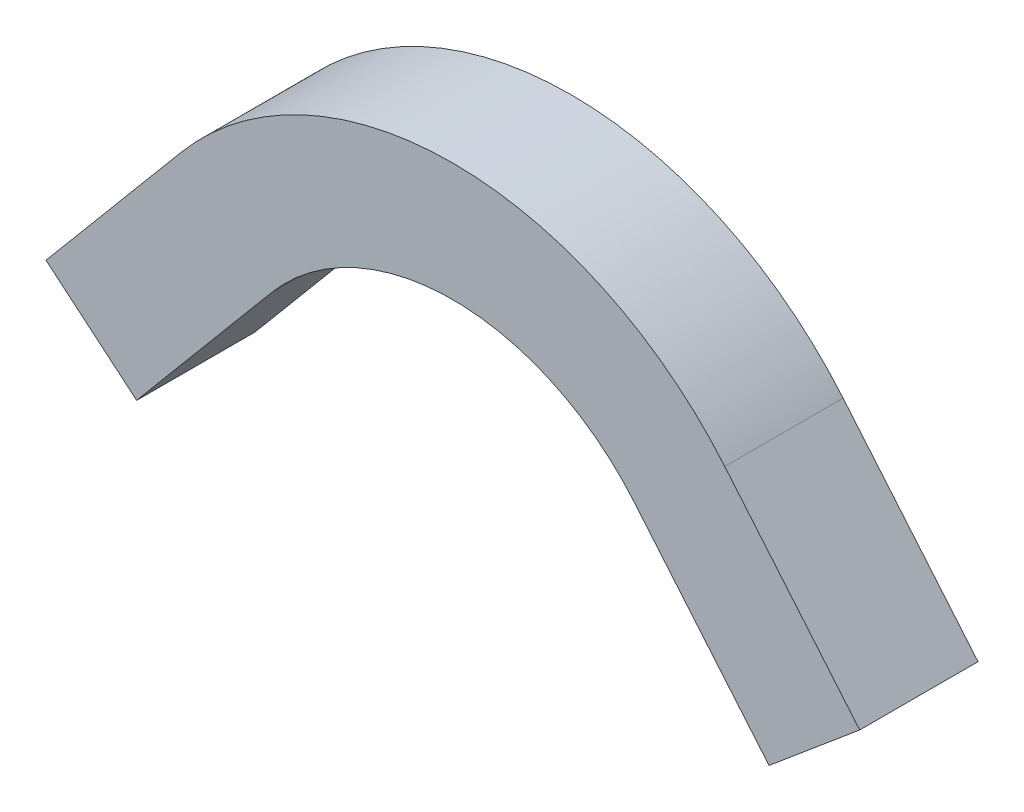
ISO-10303-21;
HEADER;
FILE_DESCRIPTION(('STEP AP214'),'2;1');
FILE_NAME('part.step','',(''),(''),'','','');
FILE_SCHEMA(('AUTOMOTIVE_DESIGN { 1 0 10303 214 1 1 1 1 }'));
ENDSEC;
DATA;
#1=APPLICATION_CONTEXT('core data for automotive mechanical design processes');
#2=APPLICATION_PROTOCOL_DEFINITION('international standard','automotive_design',2000,#1);
#3=PRODUCT_CONTEXT('',#1,'mechanical');
#4=PRODUCT('Part','Part','',(#3));
#5=PRODUCT_RELATED_PRODUCT_CATEGORY('part','',(#4));
#6=PRODUCT_DEFINITION_FORMATION('','',#4);
#7=PRODUCT_DEFINITION_CONTEXT('part definition',#1,'design');
#8=PRODUCT_DEFINITION('design','',#6,#7);
#9=PRODUCT_DEFINITION_SHAPE('','',#8);
#10=(LENGTH_UNIT() NAMED_UNIT(*) SI_UNIT(.MILLI.,.METRE.));
#11=(NAMED_UNIT(*) PLANE_ANGLE_UNIT() SI_UNIT($,.RADIAN.));
#12=(NAMED_UNIT(*) SI_UNIT($,.STERADIAN.) SOLID_ANGLE_UNIT());
#13=UNCERTAINTY_MEASURE_WITH_UNIT(LENGTH_MEASURE(1.E-05),#10,'distance_accuracy_value','');
#14=(GEOMETRIC_REPRESENTATION_CONTEXT(3) GLOBAL_UNCERTAINTY_ASSIGNED_CONTEXT((#13)) GLOBAL_UNIT_ASSIGNED_CONTEXT((#10,
#11,#12)) REPRESENTATION_CONTEXT('',''));
#15=CARTESIAN_POINT('',(0.,0.,0.));
#16=DIRECTION('',(0.,0.,1.));
#17=DIRECTION('',(1.,0.,0.));
#18=AXIS2_PLACEMENT_3D('',#15,#16,#17);
#19=CARTESIAN_POINT('',(0.,0.,10.));
#20=DIRECTION('',(0.,0.,-1.));
#21=DIRECTION('',(-1.,0.,0.));
#22=AXIS2_PLACEMENT_3D('',#19,#20,#21);
#23=CYLINDRICAL_SURFACE('',#22,60.);
#24=CARTESIAN_POINT('',(0.,0.,-10.));
#25=DIRECTION('',(0.,0.,1.));
#26=DIRECTION('',(1.,0.,0.));
#27=AXIS2_PLACEMENT_3D('',#24,#25,#26);
#28=CIRCLE('',#27,60.);
#29=CARTESIAN_POINT('',(45.9626665871387,38.5672565811923,-10.));
#30=VERTEX_POINT('',#29);
#31=CARTESIAN_POINT('',(-45.9626665871387,38.5672565811923,-10.));
#32=VERTEX_POINT('',#31);
#33=EDGE_CURVE('E59',#30,#32,#28,.T.);
#34=ORIENTED_EDGE('',*,*,#33,.T.);
#35=DIRECTION('',(0.,0.,-1.));
#36=VECTOR('',#35,1.);
#37=CARTESIAN_POINT('',(-45.9626665871387,38.5672565811923,10.));
#38=LINE('',#37,#36);
#39=CARTESIAN_POINT('',(-45.9626665871387,38.5672565811923,10.));
#40=VERTEX_POINT('',#39);
#41=EDGE_CURVE('E11',#40,#32,#38,.T.);
#42=ORIENTED_EDGE('',*,*,#41,.F.);
#43=CARTESIAN_POINT('',(0.,0.,10.));
#44=DIRECTION('',(0.,0.,1.));
#45=DIRECTION('',(1.,0.,0.));
#46=AXIS2_PLACEMENT_3D('',#43,#44,#45);
#47=CIRCLE('',#46,60.);
#48=CARTESIAN_POINT('',(45.9626665871387,38.5672565811923,10.));
#49=VERTEX_POINT('',#48);
#50=EDGE_CURVE('E49',#49,#40,#47,.T.);
#51=ORIENTED_EDGE('',*,*,#50,.F.);
#52=DIRECTION('',(0.,0.,-1.));
#53=VECTOR('',#52,1.);
#54=CARTESIAN_POINT('',(45.9626665871387,38.5672565811923,10.));
#55=LINE('',#54,#53);
#56=EDGE_CURVE('E87',#49,#30,#55,.T.);
#57=ORIENTED_EDGE('',*,*,#56,.T.);
#58=EDGE_LOOP('',(#34,#42,#51,#57));
#59=FACE_BOUND('',#58,.T.);
#60=ADVANCED_FACE('F33',(#59),#23,.T.);
#61=CARTESIAN_POINT('',(0.,0.,10.));
#62=DIRECTION('',(0.,0.,-1.));
#63=DIRECTION('',(-1.,0.,0.));
#64=AXIS2_PLACEMENT_3D('',#61,#62,#63);
#65=CYLINDRICAL_SURFACE('',#64,40.);
#66=CARTESIAN_POINT('',(0.,0.,-10.));
#67=DIRECTION('',(0.,0.,-1.));
#68=DIRECTION('',(1.,0.,0.));
#69=AXIS2_PLACEMENT_3D('',#66,#67,#68);
#70=CIRCLE('',#69,40.);
#71=CARTESIAN_POINT('',(-30.6417777247592,25.7115043874615,-10.));
#72=VERTEX_POINT('',#71);
#73=CARTESIAN_POINT('',(30.6417777247592,25.7115043874615,-10.));
#74=VERTEX_POINT('',#73);
#75=EDGE_CURVE('E68',#72,#74,#70,.T.);
#76=ORIENTED_EDGE('',*,*,#75,.T.);
#77=DIRECTION('',(0.,0.,-1.));
#78=VECTOR('',#77,1.);
#79=CARTESIAN_POINT('',(30.6417777247592,25.7115043874615,10.));
#80=LINE('',#79,#78);
#81=CARTESIAN_POINT('',(30.6417777247592,25.7115043874615,10.));
#82=VERTEX_POINT('',#81);
#83=EDGE_CURVE('E82',#82,#74,#80,.T.);
#84=ORIENTED_EDGE('',*,*,#83,.F.);
#85=CARTESIAN_POINT('',(0.,0.,10.));
#86=DIRECTION('',(0.,0.,-1.));
#87=DIRECTION('',(1.,0.,0.));
#88=AXIS2_PLACEMENT_3D('',#85,#86,#87);
#89=CIRCLE('',#88,40.);
#90=CARTESIAN_POINT('',(-30.6417777247592,25.7115043874615,10.));
#91=VERTEX_POINT('',#90);
#92=EDGE_CURVE('E77',#91,#82,#89,.T.);
#93=ORIENTED_EDGE('',*,*,#92,.F.);
#94=DIRECTION('',(0.,0.,-1.));
#95=VECTOR('',#94,1.);
#96=CARTESIAN_POINT('',(-30.6417777247592,25.7115043874615,10.));
#97=LINE('',#96,#95);
#98=EDGE_CURVE('E41',#91,#72,#97,.T.);
#99=ORIENTED_EDGE('',*,*,#98,.T.);
#100=EDGE_LOOP('',(#76,#84,#93,#99));
#101=FACE_BOUND('',#100,.T.);
#102=ADVANCED_FACE('F79',(#101),#65,.F.);
#103=CARTESIAN_POINT('',(0.,0.,10.));
#104=DIRECTION('',(0.,0.,1.));
#105=DIRECTION('',(1.,0.,0.));
#106=AXIS2_PLACEMENT_3D('',#103,#104,#105);
#107=PLANE('',#106);
#108=ORIENTED_EDGE('',*,*,#50,.T.);
#109=DIRECTION('',(0.642787609686538,0.766044443118979,0.));
#110=VECTOR('',#109,1.);
#111=CARTESIAN_POINT('',(-62.803701960926,18.4968921714751,10.));
#112=LINE('',#111,#110);
#113=CARTESIAN_POINT('',(-68.7650302962419,11.3924577112287,10.));
#114=VERTEX_POINT('',#113);
#115=EDGE_CURVE('E112',#114,#40,#112,.T.);
#116=ORIENTED_EDGE('',*,*,#115,.F.);
#117=DIRECTION('',(-0.766044443118979,0.642787609686538,0.));
#118=VECTOR('',#117,1.);
#119=CARTESIAN_POINT('',(-53.4441414338623,-1.46329448250208,10.));
#120=LINE('',#119,#118);
#121=CARTESIAN_POINT('',(-53.4441414338623,-1.46329448250208,10.));
#122=VERTEX_POINT('',#121);
#123=EDGE_CURVE('E100',#122,#114,#120,.T.);
#124=ORIENTED_EDGE('',*,*,#123,.F.);
#125=DIRECTION('',(0.642787609686538,0.766044443118979,0.));
#126=VECTOR('',#125,1.);
#127=CARTESIAN_POINT('',(-47.4828130985465,5.64113997774428,10.));
#128=LINE('',#127,#126);
#129=EDGE_CURVE('E94',#122,#91,#128,.T.);
#130=ORIENTED_EDGE('',*,*,#129,.T.);
#131=ORIENTED_EDGE('',*,*,#92,.T.);
#132=DIRECTION('',(-0.642787609686538,0.766044443118979,0.));
#133=VECTOR('',#132,1.);
#134=CARTESIAN_POINT('',(47.4828130985465,5.64113997774428,10.));
#135=LINE('',#134,#133);
#136=CARTESIAN_POINT('',(53.4441414338623,-1.46329448250208,10.));
#137=VERTEX_POINT('',#136);
#138=EDGE_CURVE('E102',#137,#82,#135,.T.);
#139=ORIENTED_EDGE('',*,*,#138,.F.);
#140=DIRECTION('',(-0.766044443118978,-0.642787609686539,0.));
#141=VECTOR('',#140,1.);
#142=CARTESIAN_POINT('',(53.4441414338623,-1.46329448250208,10.));
#143=LINE('',#142,#141);
#144=CARTESIAN_POINT('',(68.7650302962419,11.3924577112287,10.));
#145=VERTEX_POINT('',#144);
#146=EDGE_CURVE('E130',#145,#137,#143,.T.);
#147=ORIENTED_EDGE('',*,*,#146,.F.);
#148=DIRECTION('',(-0.642787609686538,0.766044443118979,0.));
#149=VECTOR('',#148,1.);
#150=CARTESIAN_POINT('',(62.803701960926,18.4968921714751,10.));
#151=LINE('',#150,#149);
#152=EDGE_CURVE('E150',#145,#49,#151,.T.);
#153=ORIENTED_EDGE('',*,*,#152,.T.);
#154=EDGE_LOOP('',(#108,#116,#124,#130,#131,#139,#147,#153));
#155=FACE_BOUND('',#154,.T.);
#156=ADVANCED_FACE('F97',(#155),#107,.T.);
#157=CARTESIAN_POINT('',(0.,0.,-10.));
#158=DIRECTION('',(0.,0.,1.));
#159=DIRECTION('',(1.,0.,0.));
#160=AXIS2_PLACEMENT_3D('',#157,#158,#159);
#161=PLANE('',#160);
#162=ORIENTED_EDGE('',*,*,#33,.F.);
#163=DIRECTION('',(-0.642787609686538,0.766044443118979,0.));
#164=VECTOR('',#163,1.);
#165=CARTESIAN_POINT('',(62.803701960926,18.4968921714751,-10.));
#166=LINE('',#165,#164);
#167=CARTESIAN_POINT('',(68.7650302962419,11.3924577112287,-10.));
#168=VERTEX_POINT('',#167);
#169=EDGE_CURVE('E164',#168,#30,#166,.T.);
#170=ORIENTED_EDGE('',*,*,#169,.F.);
#171=DIRECTION('',(-0.766044443118978,-0.642787609686539,0.));
#172=VECTOR('',#171,1.);
#173=CARTESIAN_POINT('',(53.4441414338623,-1.46329448250208,-10.));
#174=LINE('',#173,#172);
#175=CARTESIAN_POINT('',(53.4441414338623,-1.46329448250208,-10.));
#176=VERTEX_POINT('',#175);
#177=EDGE_CURVE('E169',#168,#176,#174,.T.);
#178=ORIENTED_EDGE('',*,*,#177,.T.);
#179=DIRECTION('',(-0.642787609686538,0.766044443118979,0.));
#180=VECTOR('',#179,1.);
#181=CARTESIAN_POINT('',(47.4828130985465,5.64113997774428,-10.));
#182=LINE('',#181,#180);
#183=EDGE_CURVE('E106',#176,#74,#182,.T.);
#184=ORIENTED_EDGE('',*,*,#183,.T.);
#185=ORIENTED_EDGE('',*,*,#75,.F.);
#186=DIRECTION('',(0.642787609686538,0.766044443118979,0.));
#187=VECTOR('',#186,1.);
#188=CARTESIAN_POINT('',(-47.4828130985465,5.64113997774428,-10.));
#189=LINE('',#188,#187);
#190=CARTESIAN_POINT('',(-53.4441414338623,-1.46329448250208,-10.));
#191=VERTEX_POINT('',#190);
#192=EDGE_CURVE('E96',#191,#72,#189,.T.);
#193=ORIENTED_EDGE('',*,*,#192,.F.);
#194=DIRECTION('',(-0.766044443118979,0.642787609686538,0.));
#195=VECTOR('',#194,1.);
#196=CARTESIAN_POINT('',(-53.4441414338623,-1.46329448250208,-10.));
#197=LINE('',#196,#195);
#198=CARTESIAN_POINT('',(-68.7650302962419,11.3924577112287,-10.));
#199=VERTEX_POINT('',#198);
#200=EDGE_CURVE('E147',#191,#199,#197,.T.);
#201=ORIENTED_EDGE('',*,*,#200,.T.);
#202=DIRECTION('',(0.642787609686538,0.766044443118979,0.));
#203=VECTOR('',#202,1.);
#204=CARTESIAN_POINT('',(-62.803701960926,18.4968921714751,-10.));
#205=LINE('',#204,#203);
#206=EDGE_CURVE('E104',#199,#32,#205,.T.);
#207=ORIENTED_EDGE('',*,*,#206,.T.);
#208=EDGE_LOOP('',(#162,#170,#178,#184,#185,#193,#201,#207));
#209=FACE_BOUND('',#208,.T.);
#210=ADVANCED_FACE('F145',(#209),#161,.F.);
#211=CARTESIAN_POINT('',(-62.803701960926,18.4968921714751,10.));
#212=DIRECTION('',(0.766044443118979,-0.642787609686538,0.));
#213=DIRECTION('',(0.642787609686538,0.766044443118979,0.));
#214=AXIS2_PLACEMENT_3D('',#211,#212,#213);
#215=PLANE('',#214);
#216=ORIENTED_EDGE('',*,*,#41,.T.);
#217=ORIENTED_EDGE('',*,*,#206,.F.);
#218=DIRECTION('',(0.,0.,-1.));
#219=VECTOR('',#218,1.);
#220=CARTESIAN_POINT('',(-68.7650302962419,11.3924577112287,39.1777624246873));
#221=LINE('',#220,#219);
#222=EDGE_CURVE('E151',#114,#199,#221,.T.);
#223=ORIENTED_EDGE('',*,*,#222,.F.);
#224=ORIENTED_EDGE('',*,*,#115,.T.);
#225=EDGE_LOOP('',(#216,#217,#223,#224));
#226=FACE_BOUND('',#225,.T.);
#227=ADVANCED_FACE('F179',(#226),#215,.F.);
#228=CARTESIAN_POINT('',(-47.4828130985465,5.64113997774428,10.));
#229=DIRECTION('',(-0.766044443118979,0.642787609686538,0.));
#230=DIRECTION('',(-0.642787609686538,-0.766044443118979,0.));
#231=AXIS2_PLACEMENT_3D('',#228,#229,#230);
#232=PLANE('',#231);
#233=ORIENTED_EDGE('',*,*,#98,.F.);
#234=ORIENTED_EDGE('',*,*,#129,.F.);
#235=DIRECTION('',(0.,0.,-1.));
#236=VECTOR('',#235,1.);
#237=CARTESIAN_POINT('',(-53.4441414338623,-1.46329448250208,39.1777624246873));
#238=LINE('',#237,#236);
#239=EDGE_CURVE('E148',#122,#191,#238,.T.);
#240=ORIENTED_EDGE('',*,*,#239,.T.);
#241=ORIENTED_EDGE('',*,*,#192,.T.);
#242=EDGE_LOOP('',(#233,#234,#240,#241));
#243=FACE_BOUND('',#242,.T.);
#244=ADVANCED_FACE('F91',(#243),#232,.F.);
#245=CARTESIAN_POINT('',(47.4828130985465,5.64113997774428,10.));
#246=DIRECTION('',(-0.766044443118979,-0.642787609686538,0.));
#247=DIRECTION('',(0.642787609686538,-0.766044443118979,0.));
#248=AXIS2_PLACEMENT_3D('',#245,#246,#247);
#249=PLANE('',#248);
#250=ORIENTED_EDGE('',*,*,#83,.T.);
#251=ORIENTED_EDGE('',*,*,#183,.F.);
#252=DIRECTION('',(0.,0.,-1.));
#253=VECTOR('',#252,1.);
#254=CARTESIAN_POINT('',(53.4441414338623,-1.46329448250208,39.1777624246873));
#255=LINE('',#254,#253);
#256=EDGE_CURVE('E126',#137,#176,#255,.T.);
#257=ORIENTED_EDGE('',*,*,#256,.F.);
#258=ORIENTED_EDGE('',*,*,#138,.T.);
#259=EDGE_LOOP('',(#250,#251,#257,#258));
#260=FACE_BOUND('',#259,.T.);
#261=ADVANCED_FACE('F121',(#260),#249,.T.);
#262=CARTESIAN_POINT('',(62.803701960926,18.4968921714751,10.));
#263=DIRECTION('',(0.766044443118979,0.642787609686538,0.));
#264=DIRECTION('',(-0.642787609686538,0.766044443118979,0.));
#265=AXIS2_PLACEMENT_3D('',#262,#263,#264);
#266=PLANE('',#265);
#267=ORIENTED_EDGE('',*,*,#56,.F.);
#268=ORIENTED_EDGE('',*,*,#152,.F.);
#269=DIRECTION('',(0.,0.,-1.));
#270=VECTOR('',#269,1.);
#271=CARTESIAN_POINT('',(68.7650302962419,11.3924577112287,39.1777624246873));
#272=LINE('',#271,#270);
#273=EDGE_CURVE('E160',#145,#168,#272,.T.);
#274=ORIENTED_EDGE('',*,*,#273,.T.);
#275=ORIENTED_EDGE('',*,*,#169,.T.);
#276=EDGE_LOOP('',(#267,#268,#274,#275));
#277=FACE_BOUND('',#276,.T.);
#278=ADVANCED_FACE('F177',(#277),#266,.T.);
#279=CARTESIAN_POINT('',(-53.4441414338623,-1.46329448250208,39.1777624246873));
#280=DIRECTION('',(-0.642787609686538,-0.766044443118979,0.));
#281=DIRECTION('',(0.766044443118979,-0.642787609686538,0.));
#282=AXIS2_PLACEMENT_3D('',#279,#280,#281);
#283=PLANE('',#282);
#284=ORIENTED_EDGE('',*,*,#239,.F.);
#285=ORIENTED_EDGE('',*,*,#123,.T.);
#286=ORIENTED_EDGE('',*,*,#222,.T.);
#287=ORIENTED_EDGE('',*,*,#200,.F.);
#288=EDGE_LOOP('',(#284,#285,#286,#287));
#289=FACE_BOUND('',#288,.T.);
#290=ADVANCED_FACE('F154',(#289),#283,.T.);
#291=CARTESIAN_POINT('',(53.4441414338623,-1.46329448250208,39.1777624246873));
#292=DIRECTION('',(0.642787609686539,-0.766044443118978,0.));
#293=DIRECTION('',(0.766044443118978,0.642787609686539,0.));
#294=AXIS2_PLACEMENT_3D('',#291,#292,#293);
#295=PLANE('',#294);
#296=ORIENTED_EDGE('',*,*,#273,.F.);
#297=ORIENTED_EDGE('',*,*,#146,.T.);
#298=ORIENTED_EDGE('',*,*,#256,.T.);
#299=ORIENTED_EDGE('',*,*,#177,.F.);
#300=EDGE_LOOP('',(#296,#297,#298,#299));
#301=FACE_BOUND('',#300,.T.);
#302=ADVANCED_FACE('F174',(#301),#295,.T.);
#303=CLOSED_SHELL('',(#60,#102,#156,#210,#227,#244,#261,#278,#290,#302));
#304=MANIFOLD_SOLID_BREP('B2',#303);
#305=ADVANCED_BREP_SHAPE_REPRESENTATION('',(#18,#304),#14);
#306=SHAPE_DEFINITION_REPRESENTATION(#9,#305);
ENDSEC;
END-ISO-10303-21;
